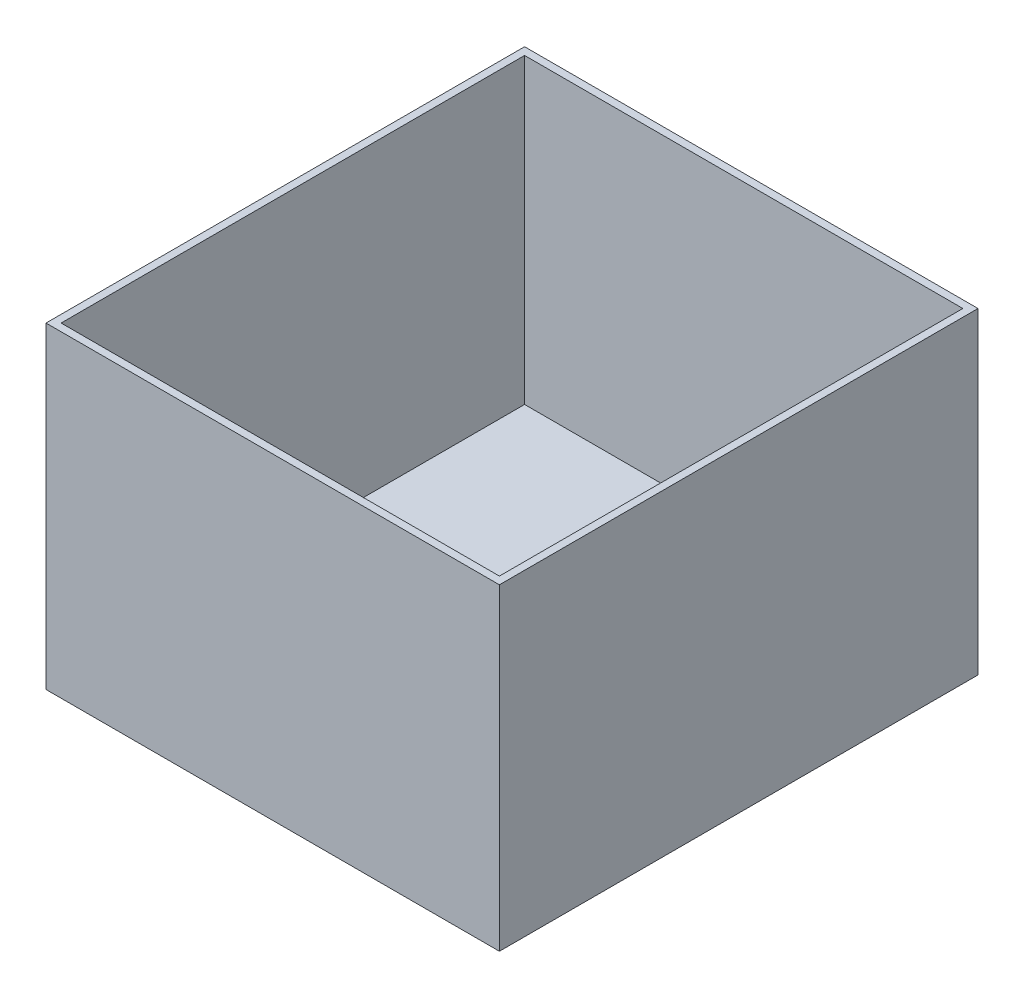
ISO-10303-21;
HEADER;
FILE_DESCRIPTION(('STEP AP214'),'2;1');
FILE_NAME('part.step','',(''),(''),'','','');
FILE_SCHEMA(('AUTOMOTIVE_DESIGN { 1 0 10303 214 1 1 1 1 }'));
ENDSEC;
DATA;
#1=APPLICATION_CONTEXT('core data for automotive mechanical design processes');
#2=APPLICATION_PROTOCOL_DEFINITION('international standard','automotive_design',2000,#1);
#3=PRODUCT_CONTEXT('',#1,'mechanical');
#4=PRODUCT('Part','Part','',(#3));
#5=PRODUCT_RELATED_PRODUCT_CATEGORY('part','',(#4));
#6=PRODUCT_DEFINITION_FORMATION('','',#4);
#7=PRODUCT_DEFINITION_CONTEXT('part definition',#1,'design');
#8=PRODUCT_DEFINITION('design','',#6,#7);
#9=PRODUCT_DEFINITION_SHAPE('','',#8);
#10=(LENGTH_UNIT() NAMED_UNIT(*) SI_UNIT(.MILLI.,.METRE.));
#11=(NAMED_UNIT(*) PLANE_ANGLE_UNIT() SI_UNIT($,.RADIAN.));
#12=(NAMED_UNIT(*) SI_UNIT($,.STERADIAN.) SOLID_ANGLE_UNIT());
#13=UNCERTAINTY_MEASURE_WITH_UNIT(LENGTH_MEASURE(1.E-05),#10,'distance_accuracy_value','');
#14=(GEOMETRIC_REPRESENTATION_CONTEXT(3) GLOBAL_UNCERTAINTY_ASSIGNED_CONTEXT((#13)) GLOBAL_UNIT_ASSIGNED_CONTEXT((#10,
#11,#12)) REPRESENTATION_CONTEXT('',''));
#15=CARTESIAN_POINT('',(0.,0.,0.));
#16=DIRECTION('',(0.,0.,1.));
#17=DIRECTION('',(1.,0.,0.));
#18=AXIS2_PLACEMENT_3D('',#15,#16,#17);
#19=CARTESIAN_POINT('',(45.,-3.,-47.5));
#20=DIRECTION('',(1.,0.,0.));
#21=DIRECTION('',(0.,0.,-1.));
#22=AXIS2_PLACEMENT_3D('',#19,#20,#21);
#23=PLANE('',#22);
#24=DIRECTION('',(0.,1.,0.));
#25=VECTOR('',#24,1.);
#26=CARTESIAN_POINT('',(45.,-3.,-47.5));
#27=LINE('',#26,#25);
#28=CARTESIAN_POINT('',(45.,-3.,-47.5));
#29=VERTEX_POINT('',#28);
#30=CARTESIAN_POINT('',(45.,60.,-47.5));
#31=VERTEX_POINT('',#30);
#32=EDGE_CURVE('E46',#29,#31,#27,.T.);
#33=ORIENTED_EDGE('',*,*,#32,.T.);
#34=DIRECTION('',(0.,0.,-1.));
#35=VECTOR('',#34,1.);
#36=CARTESIAN_POINT('',(45.,60.,-47.5));
#37=LINE('',#36,#35);
#38=CARTESIAN_POINT('',(45.,60.,47.5));
#39=VERTEX_POINT('',#38);
#40=EDGE_CURVE('E149',#39,#31,#37,.T.);
#41=ORIENTED_EDGE('',*,*,#40,.F.);
#42=DIRECTION('',(0.,1.,0.));
#43=VECTOR('',#42,1.);
#44=CARTESIAN_POINT('',(45.,-3.,47.5));
#45=LINE('',#44,#43);
#46=CARTESIAN_POINT('',(45.,-3.,47.5));
#47=VERTEX_POINT('',#46);
#48=EDGE_CURVE('E11',#47,#39,#45,.T.);
#49=ORIENTED_EDGE('',*,*,#48,.F.);
#50=DIRECTION('',(0.,0.,-1.));
#51=VECTOR('',#50,1.);
#52=CARTESIAN_POINT('',(45.,-3.,-47.5));
#53=LINE('',#52,#51);
#54=EDGE_CURVE('E155',#47,#29,#53,.T.);
#55=ORIENTED_EDGE('',*,*,#54,.T.);
#56=EDGE_LOOP('',(#33,#41,#49,#55));
#57=FACE_BOUND('',#56,.T.);
#58=ADVANCED_FACE('F43',(#57),#23,.T.);
#59=CARTESIAN_POINT('',(-45.,-3.,47.5));
#60=DIRECTION('',(0.,0.,1.));
#61=DIRECTION('',(1.,0.,0.));
#62=AXIS2_PLACEMENT_3D('',#59,#60,#61);
#63=PLANE('',#62);
#64=ORIENTED_EDGE('',*,*,#48,.T.);
#65=DIRECTION('',(1.,0.,0.));
#66=VECTOR('',#65,1.);
#67=CARTESIAN_POINT('',(-45.,60.,47.5));
#68=LINE('',#67,#66);
#69=CARTESIAN_POINT('',(-45.,60.,47.5));
#70=VERTEX_POINT('',#69);
#71=EDGE_CURVE('E146',#70,#39,#68,.T.);
#72=ORIENTED_EDGE('',*,*,#71,.F.);
#73=DIRECTION('',(0.,1.,0.));
#74=VECTOR('',#73,1.);
#75=CARTESIAN_POINT('',(-45.,-3.,47.5));
#76=LINE('',#75,#74);
#77=CARTESIAN_POINT('',(-45.,-3.,47.5));
#78=VERTEX_POINT('',#77);
#79=EDGE_CURVE('E51',#78,#70,#76,.T.);
#80=ORIENTED_EDGE('',*,*,#79,.F.);
#81=DIRECTION('',(1.,0.,0.));
#82=VECTOR('',#81,1.);
#83=CARTESIAN_POINT('',(-45.,-3.,47.5));
#84=LINE('',#83,#82);
#85=EDGE_CURVE('E164',#78,#47,#84,.T.);
#86=ORIENTED_EDGE('',*,*,#85,.T.);
#87=EDGE_LOOP('',(#64,#72,#80,#86));
#88=FACE_BOUND('',#87,.T.);
#89=ADVANCED_FACE('F188',(#88),#63,.T.);
#90=CARTESIAN_POINT('',(-45.,-3.,-47.5));
#91=DIRECTION('',(-1.,0.,0.));
#92=DIRECTION('',(0.,0.,1.));
#93=AXIS2_PLACEMENT_3D('',#90,#91,#92);
#94=PLANE('',#93);
#95=ORIENTED_EDGE('',*,*,#79,.T.);
#96=DIRECTION('',(0.,0.,1.));
#97=VECTOR('',#96,1.);
#98=CARTESIAN_POINT('',(-45.,60.,-47.5));
#99=LINE('',#98,#97);
#100=CARTESIAN_POINT('',(-45.,60.,-47.5));
#101=VERTEX_POINT('',#100);
#102=EDGE_CURVE('E122',#101,#70,#99,.T.);
#103=ORIENTED_EDGE('',*,*,#102,.F.);
#104=DIRECTION('',(0.,1.,0.));
#105=VECTOR('',#104,1.);
#106=CARTESIAN_POINT('',(-45.,-3.,-47.5));
#107=LINE('',#106,#105);
#108=CARTESIAN_POINT('',(-45.,-3.,-47.5));
#109=VERTEX_POINT('',#108);
#110=EDGE_CURVE('E167',#109,#101,#107,.T.);
#111=ORIENTED_EDGE('',*,*,#110,.F.);
#112=DIRECTION('',(0.,0.,1.));
#113=VECTOR('',#112,1.);
#114=CARTESIAN_POINT('',(-45.,-3.,-47.5));
#115=LINE('',#114,#113);
#116=EDGE_CURVE('E161',#109,#78,#115,.T.);
#117=ORIENTED_EDGE('',*,*,#116,.T.);
#118=EDGE_LOOP('',(#95,#103,#111,#117));
#119=FACE_BOUND('',#118,.T.);
#120=ADVANCED_FACE('F180',(#119),#94,.T.);
#121=CARTESIAN_POINT('',(-45.,-3.,-47.5));
#122=DIRECTION('',(0.,0.,-1.));
#123=DIRECTION('',(-1.,0.,0.));
#124=AXIS2_PLACEMENT_3D('',#121,#122,#123);
#125=PLANE('',#124);
#126=ORIENTED_EDGE('',*,*,#110,.T.);
#127=DIRECTION('',(-1.,0.,0.));
#128=VECTOR('',#127,1.);
#129=CARTESIAN_POINT('',(-45.,60.,-47.5));
#130=LINE('',#129,#128);
#131=EDGE_CURVE('E152',#31,#101,#130,.T.);
#132=ORIENTED_EDGE('',*,*,#131,.F.);
#133=ORIENTED_EDGE('',*,*,#32,.F.);
#134=DIRECTION('',(-1.,0.,0.));
#135=VECTOR('',#134,1.);
#136=CARTESIAN_POINT('',(-45.,-3.,-47.5));
#137=LINE('',#136,#135);
#138=EDGE_CURVE('E158',#29,#109,#137,.T.);
#139=ORIENTED_EDGE('',*,*,#138,.T.);
#140=EDGE_LOOP('',(#126,#132,#133,#139));
#141=FACE_BOUND('',#140,.T.);
#142=ADVANCED_FACE('F177',(#141),#125,.T.);
#143=CARTESIAN_POINT('',(0.,-3.,0.));
#144=DIRECTION('',(0.,1.,0.));
#145=DIRECTION('',(0.,0.,1.));
#146=AXIS2_PLACEMENT_3D('',#143,#144,#145);
#147=PLANE('',#146);
#148=ORIENTED_EDGE('',*,*,#54,.F.);
#149=ORIENTED_EDGE('',*,*,#85,.F.);
#150=ORIENTED_EDGE('',*,*,#116,.F.);
#151=ORIENTED_EDGE('',*,*,#138,.F.);
#152=EDGE_LOOP('',(#148,#149,#150,#151));
#153=FACE_BOUND('',#152,.T.);
#154=ADVANCED_FACE('F179',(#153),#147,.F.);
#155=CARTESIAN_POINT('',(0.,60.,0.));
#156=DIRECTION('',(0.,1.,0.));
#157=DIRECTION('',(0.,0.,1.));
#158=AXIS2_PLACEMENT_3D('',#155,#156,#157);
#159=PLANE('',#158);
#160=ORIENTED_EDGE('',*,*,#102,.T.);
#161=ORIENTED_EDGE('',*,*,#71,.T.);
#162=ORIENTED_EDGE('',*,*,#40,.T.);
#163=ORIENTED_EDGE('',*,*,#131,.T.);
#164=EDGE_LOOP('',(#160,#161,#162,#163));
#165=FACE_BOUND('',#164,.T.);
#166=DIRECTION('',(1.,0.,0.));
#167=VECTOR('',#166,1.);
#168=CARTESIAN_POINT('',(-43.5,60.,46.));
#169=LINE('',#168,#167);
#170=CARTESIAN_POINT('',(-43.5,60.,46.));
#171=VERTEX_POINT('',#170);
#172=CARTESIAN_POINT('',(43.5,60.,46.));
#173=VERTEX_POINT('',#172);
#174=EDGE_CURVE('E116',#171,#173,#169,.T.);
#175=ORIENTED_EDGE('',*,*,#174,.F.);
#176=DIRECTION('',(0.,0.,1.));
#177=VECTOR('',#176,1.);
#178=CARTESIAN_POINT('',(-43.5,60.,-46.));
#179=LINE('',#178,#177);
#180=CARTESIAN_POINT('',(-43.5,60.,-46.));
#181=VERTEX_POINT('',#180);
#182=EDGE_CURVE('E107',#181,#171,#179,.T.);
#183=ORIENTED_EDGE('',*,*,#182,.F.);
#184=DIRECTION('',(-1.,0.,0.));
#185=VECTOR('',#184,1.);
#186=CARTESIAN_POINT('',(-43.5,60.,-46.));
#187=LINE('',#186,#185);
#188=CARTESIAN_POINT('',(43.5,60.,-46.));
#189=VERTEX_POINT('',#188);
#190=EDGE_CURVE('E130',#189,#181,#187,.T.);
#191=ORIENTED_EDGE('',*,*,#190,.F.);
#192=DIRECTION('',(0.,0.,-1.));
#193=VECTOR('',#192,1.);
#194=CARTESIAN_POINT('',(43.5,60.,-46.));
#195=LINE('',#194,#193);
#196=EDGE_CURVE('E128',#173,#189,#195,.T.);
#197=ORIENTED_EDGE('',*,*,#196,.F.);
#198=EDGE_LOOP('',(#175,#183,#191,#197));
#199=FACE_BOUND('',#198,.T.);
#200=ADVANCED_FACE('F126',(#165,#199),#159,.T.);
#201=CARTESIAN_POINT('',(-43.5,60.,-46.));
#202=DIRECTION('',(1.,0.,0.));
#203=DIRECTION('',(0.,0.,-1.));
#204=AXIS2_PLACEMENT_3D('',#201,#202,#203);
#205=PLANE('',#204);
#206=DIRECTION('',(0.,0.,1.));
#207=VECTOR('',#206,1.);
#208=CARTESIAN_POINT('',(-43.5,0.,-46.));
#209=LINE('',#208,#207);
#210=CARTESIAN_POINT('',(-43.5,0.,-46.));
#211=VERTEX_POINT('',#210);
#212=CARTESIAN_POINT('',(-43.5,0.,46.));
#213=VERTEX_POINT('',#212);
#214=EDGE_CURVE('E59',#211,#213,#209,.T.);
#215=ORIENTED_EDGE('',*,*,#214,.F.);
#216=DIRECTION('',(0.,-1.,0.));
#217=VECTOR('',#216,1.);
#218=CARTESIAN_POINT('',(-43.5,60.,-46.));
#219=LINE('',#218,#217);
#220=EDGE_CURVE('E112',#181,#211,#219,.T.);
#221=ORIENTED_EDGE('',*,*,#220,.F.);
#222=ORIENTED_EDGE('',*,*,#182,.T.);
#223=DIRECTION('',(0.,-1.,0.));
#224=VECTOR('',#223,1.);
#225=CARTESIAN_POINT('',(-43.5,60.,46.));
#226=LINE('',#225,#224);
#227=EDGE_CURVE('E110',#171,#213,#226,.T.);
#228=ORIENTED_EDGE('',*,*,#227,.T.);
#229=EDGE_LOOP('',(#215,#221,#222,#228));
#230=FACE_BOUND('',#229,.T.);
#231=ADVANCED_FACE('F109',(#230),#205,.T.);
#232=CARTESIAN_POINT('',(-43.5,60.,46.));
#233=DIRECTION('',(0.,0.,-1.));
#234=DIRECTION('',(-1.,0.,0.));
#235=AXIS2_PLACEMENT_3D('',#232,#233,#234);
#236=PLANE('',#235);
#237=DIRECTION('',(1.,0.,0.));
#238=VECTOR('',#237,1.);
#239=CARTESIAN_POINT('',(-43.5,0.,46.));
#240=LINE('',#239,#238);
#241=CARTESIAN_POINT('',(43.5,0.,46.));
#242=VERTEX_POINT('',#241);
#243=EDGE_CURVE('E63',#213,#242,#240,.T.);
#244=ORIENTED_EDGE('',*,*,#243,.F.);
#245=ORIENTED_EDGE('',*,*,#227,.F.);
#246=ORIENTED_EDGE('',*,*,#174,.T.);
#247=DIRECTION('',(0.,-1.,0.));
#248=VECTOR('',#247,1.);
#249=CARTESIAN_POINT('',(43.5,60.,46.));
#250=LINE('',#249,#248);
#251=EDGE_CURVE('E123',#173,#242,#250,.T.);
#252=ORIENTED_EDGE('',*,*,#251,.T.);
#253=EDGE_LOOP('',(#244,#245,#246,#252));
#254=FACE_BOUND('',#253,.T.);
#255=ADVANCED_FACE('F120',(#254),#236,.T.);
#256=CARTESIAN_POINT('',(43.5,60.,-46.));
#257=DIRECTION('',(-1.,0.,0.));
#258=DIRECTION('',(0.,0.,1.));
#259=AXIS2_PLACEMENT_3D('',#256,#257,#258);
#260=PLANE('',#259);
#261=DIRECTION('',(0.,0.,-1.));
#262=VECTOR('',#261,1.);
#263=CARTESIAN_POINT('',(43.5,0.,-46.));
#264=LINE('',#263,#262);
#265=CARTESIAN_POINT('',(43.5,0.,-46.));
#266=VERTEX_POINT('',#265);
#267=EDGE_CURVE('E136',#242,#266,#264,.T.);
#268=ORIENTED_EDGE('',*,*,#267,.F.);
#269=ORIENTED_EDGE('',*,*,#251,.F.);
#270=ORIENTED_EDGE('',*,*,#196,.T.);
#271=DIRECTION('',(0.,-1.,0.));
#272=VECTOR('',#271,1.);
#273=CARTESIAN_POINT('',(43.5,60.,-46.));
#274=LINE('',#273,#272);
#275=EDGE_CURVE('E140',#189,#266,#274,.T.);
#276=ORIENTED_EDGE('',*,*,#275,.T.);
#277=EDGE_LOOP('',(#268,#269,#270,#276));
#278=FACE_BOUND('',#277,.T.);
#279=ADVANCED_FACE('F210',(#278),#260,.T.);
#280=CARTESIAN_POINT('',(-43.5,60.,-46.));
#281=DIRECTION('',(0.,0.,1.));
#282=DIRECTION('',(1.,0.,0.));
#283=AXIS2_PLACEMENT_3D('',#280,#281,#282);
#284=PLANE('',#283);
#285=DIRECTION('',(-1.,0.,0.));
#286=VECTOR('',#285,1.);
#287=CARTESIAN_POINT('',(-43.5,0.,-46.));
#288=LINE('',#287,#286);
#289=EDGE_CURVE('E117',#266,#211,#288,.T.);
#290=ORIENTED_EDGE('',*,*,#289,.F.);
#291=ORIENTED_EDGE('',*,*,#275,.F.);
#292=ORIENTED_EDGE('',*,*,#190,.T.);
#293=ORIENTED_EDGE('',*,*,#220,.T.);
#294=EDGE_LOOP('',(#290,#291,#292,#293));
#295=FACE_BOUND('',#294,.T.);
#296=ADVANCED_FACE('F203',(#295),#284,.T.);
#297=CARTESIAN_POINT('',(0.,0.,0.));
#298=DIRECTION('',(0.,1.,0.));
#299=DIRECTION('',(0.,0.,1.));
#300=AXIS2_PLACEMENT_3D('',#297,#298,#299);
#301=PLANE('',#300);
#302=ORIENTED_EDGE('',*,*,#214,.T.);
#303=ORIENTED_EDGE('',*,*,#243,.T.);
#304=ORIENTED_EDGE('',*,*,#267,.T.);
#305=ORIENTED_EDGE('',*,*,#289,.T.);
#306=EDGE_LOOP('',(#302,#303,#304,#305));
#307=FACE_BOUND('',#306,.T.);
#308=ADVANCED_FACE('F201',(#307),#301,.T.);
#309=CLOSED_SHELL('',(#58,#89,#120,#142,#154,#200,#231,#255,#279,#296,#308));
#310=MANIFOLD_SOLID_BREP('B2',#309);
#311=ADVANCED_BREP_SHAPE_REPRESENTATION('',(#18,#310),#14);
#312=SHAPE_DEFINITION_REPRESENTATION(#9,#311);
ENDSEC;
END-ISO-10303-21;
